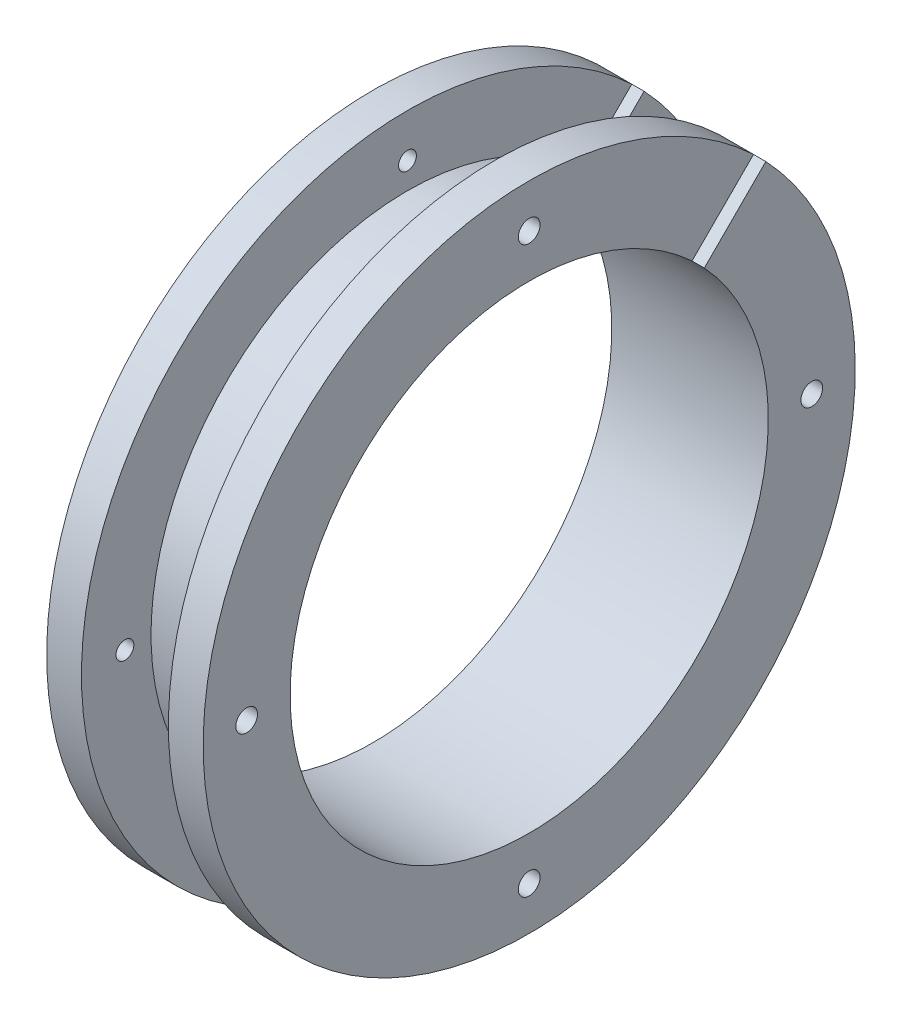
ISO-10303-21;
HEADER;
FILE_DESCRIPTION(('STEP AP214'),'2;1');
FILE_NAME('part.step','',(''),(''),'','','');
FILE_SCHEMA(('AUTOMOTIVE_DESIGN { 1 0 10303 214 1 1 1 1 }'));
ENDSEC;
DATA;
#1=APPLICATION_CONTEXT('core data for automotive mechanical design processes');
#2=APPLICATION_PROTOCOL_DEFINITION('international standard','automotive_design',2000,#1);
#3=PRODUCT_CONTEXT('',#1,'mechanical');
#4=PRODUCT('Part','Part','',(#3));
#5=PRODUCT_RELATED_PRODUCT_CATEGORY('part','',(#4));
#6=PRODUCT_DEFINITION_FORMATION('','',#4);
#7=PRODUCT_DEFINITION_CONTEXT('part definition',#1,'design');
#8=PRODUCT_DEFINITION('design','',#6,#7);
#9=PRODUCT_DEFINITION_SHAPE('','',#8);
#10=(LENGTH_UNIT() NAMED_UNIT(*) SI_UNIT(.MILLI.,.METRE.));
#11=(NAMED_UNIT(*) PLANE_ANGLE_UNIT() SI_UNIT($,.RADIAN.));
#12=(NAMED_UNIT(*) SI_UNIT($,.STERADIAN.) SOLID_ANGLE_UNIT());
#13=UNCERTAINTY_MEASURE_WITH_UNIT(LENGTH_MEASURE(1.E-05),#10,'distance_accuracy_value','');
#14=(GEOMETRIC_REPRESENTATION_CONTEXT(3) GLOBAL_UNCERTAINTY_ASSIGNED_CONTEXT((#13)) GLOBAL_UNIT_ASSIGNED_CONTEXT((#10,
#11,#12)) REPRESENTATION_CONTEXT('',''));
#15=CARTESIAN_POINT('',(0.,0.,0.));
#16=DIRECTION('',(0.,0.,1.));
#17=DIRECTION('',(1.,0.,0.));
#18=AXIS2_PLACEMENT_3D('',#15,#16,#17);
#19=CARTESIAN_POINT('',(-18.,37.5,0.));
#20=DIRECTION('',(-1.,0.,0.));
#21=DIRECTION('',(0.,0.,1.));
#22=AXIS2_PLACEMENT_3D('',#19,#20,#21);
#23=PLANE('',#22);
#24=DIRECTION('',(0.,-0.707106781186547,0.707106781186548));
#25=VECTOR('',#24,1.);
#26=CARTESIAN_POINT('',(-18.,18.7254689616222,-20.1396825239953));
#27=LINE('',#26,#25);
#28=CARTESIAN_POINT('',(-18.,25.799967746192,-27.2141813085651));
#29=VERTEX_POINT('',#28);
#30=CARTESIAN_POINT('',(-18.,18.7254689616222,-20.1396825239953));
#31=VERTEX_POINT('',#30);
#32=EDGE_CURVE('E98',#29,#31,#27,.T.);
#33=ORIENTED_EDGE('',*,*,#32,.F.);
#34=CARTESIAN_POINT('',(-18.,0.,0.));
#35=DIRECTION('',(1.,0.,0.));
#36=DIRECTION('',(0.,0.,-1.));
#37=AXIS2_PLACEMENT_3D('',#34,#35,#36);
#38=CIRCLE('',#37,37.5);
#39=CARTESIAN_POINT('',(-18.,27.2141813085651,-25.799967746192));
#40=VERTEX_POINT('',#39);
#41=EDGE_CURVE('E148',#40,#29,#38,.T.);
#42=ORIENTED_EDGE('',*,*,#41,.F.);
#43=DIRECTION('',(0.,0.707106781186547,-0.707106781186548));
#44=VECTOR('',#43,1.);
#45=CARTESIAN_POINT('',(-18.,27.2236110756821,-25.809397513309));
#46=LINE('',#45,#44);
#47=CARTESIAN_POINT('',(-18.,20.1396825239953,-18.7254689616222));
#48=VERTEX_POINT('',#47);
#49=EDGE_CURVE('E52',#48,#40,#46,.T.);
#50=ORIENTED_EDGE('',*,*,#49,.F.);
#51=CARTESIAN_POINT('',(-18.,0.,0.));
#52=DIRECTION('',(1.,0.,0.));
#53=DIRECTION('',(0.,0.,-1.));
#54=AXIS2_PLACEMENT_3D('',#51,#52,#53);
#55=CIRCLE('',#54,27.5);
#56=EDGE_CURVE('E118',#48,#31,#55,.T.);
#57=ORIENTED_EDGE('',*,*,#56,.T.);
#58=EDGE_LOOP('',(#33,#42,#50,#57));
#59=FACE_BOUND('',#58,.T.);
#60=CARTESIAN_POINT('',(-18.,-32.5,0.));
#61=DIRECTION('',(-1.,0.,0.));
#62=DIRECTION('',(0.,0.,1.));
#63=AXIS2_PLACEMENT_3D('',#60,#61,#62);
#64=CIRCLE('',#63,1.02499999999999);
#65=CARTESIAN_POINT('',(-18.,-32.5,1.02499999999998));
#66=VERTEX_POINT('',#65);
#67=EDGE_CURVE('E198',#66,#66,#64,.T.);
#68=ORIENTED_EDGE('',*,*,#67,.F.);
#69=EDGE_LOOP('',(#68));
#70=FACE_BOUND('',#69,.T.);
#71=CARTESIAN_POINT('',(-18.,0.,-32.5));
#72=DIRECTION('',(-1.,0.,0.));
#73=DIRECTION('',(0.,0.,1.));
#74=AXIS2_PLACEMENT_3D('',#71,#72,#73);
#75=CIRCLE('',#74,1.02499999999999);
#76=CARTESIAN_POINT('',(-18.,0.,-31.475));
#77=VERTEX_POINT('',#76);
#78=EDGE_CURVE('E204',#77,#77,#75,.T.);
#79=ORIENTED_EDGE('',*,*,#78,.F.);
#80=EDGE_LOOP('',(#79));
#81=FACE_BOUND('',#80,.T.);
#82=CARTESIAN_POINT('',(-18.,0.,32.5));
#83=DIRECTION('',(-1.,0.,0.));
#84=DIRECTION('',(0.,0.,1.));
#85=AXIS2_PLACEMENT_3D('',#82,#83,#84);
#86=CIRCLE('',#85,1.02499999999999);
#87=CARTESIAN_POINT('',(-18.,0.,33.525));
#88=VERTEX_POINT('',#87);
#89=EDGE_CURVE('E210',#88,#88,#86,.T.);
#90=ORIENTED_EDGE('',*,*,#89,.F.);
#91=EDGE_LOOP('',(#90));
#92=FACE_BOUND('',#91,.T.);
#93=CARTESIAN_POINT('',(-18.,32.5,0.));
#94=DIRECTION('',(-1.,0.,0.));
#95=DIRECTION('',(0.,0.,1.));
#96=AXIS2_PLACEMENT_3D('',#93,#94,#95);
#97=CIRCLE('',#96,1.02499999999999);
#98=CARTESIAN_POINT('',(-18.,32.5,1.02499999999996));
#99=VERTEX_POINT('',#98);
#100=EDGE_CURVE('E216',#99,#99,#97,.T.);
#101=ORIENTED_EDGE('',*,*,#100,.F.);
#102=EDGE_LOOP('',(#101));
#103=FACE_BOUND('',#102,.T.);
#104=ADVANCED_FACE('F31',(#59,#70,#81,#92,#103),#23,.T.);
#105=CARTESIAN_POINT('',(0.,0.,0.));
#106=DIRECTION('',(1.,0.,0.));
#107=DIRECTION('',(0.,0.,-1.));
#108=AXIS2_PLACEMENT_3D('',#105,#106,#107);
#109=CYLINDRICAL_SURFACE('',#108,27.5);
#110=DIRECTION('',(-1.,0.,0.));
#111=VECTOR('',#110,1.);
#112=CARTESIAN_POINT('',(0.,18.7254689616222,-20.1396825239953));
#113=LINE('',#112,#111);
#114=CARTESIAN_POINT('',(0.,18.7254689616222,-20.1396825239953));
#115=VERTEX_POINT('',#114);
#116=EDGE_CURVE('E92',#115,#31,#113,.T.);
#117=ORIENTED_EDGE('',*,*,#116,.T.);
#118=ORIENTED_EDGE('',*,*,#56,.F.);
#119=DIRECTION('',(-1.,0.,0.));
#120=VECTOR('',#119,1.);
#121=CARTESIAN_POINT('',(0.,20.1396825239953,-18.7254689616222));
#122=LINE('',#121,#120);
#123=CARTESIAN_POINT('',(0.,20.1396825239953,-18.7254689616222));
#124=VERTEX_POINT('',#123);
#125=EDGE_CURVE('E103',#124,#48,#122,.T.);
#126=ORIENTED_EDGE('',*,*,#125,.F.);
#127=CARTESIAN_POINT('',(0.,0.,0.));
#128=DIRECTION('',(1.,0.,0.));
#129=DIRECTION('',(0.,0.,-1.));
#130=AXIS2_PLACEMENT_3D('',#127,#128,#129);
#131=CIRCLE('',#130,27.5);
#132=EDGE_CURVE('E112',#124,#115,#131,.T.);
#133=ORIENTED_EDGE('',*,*,#132,.T.);
#134=EDGE_LOOP('',(#117,#118,#126,#133));
#135=FACE_BOUND('',#134,.T.);
#136=ADVANCED_FACE('F117',(#135),#109,.F.);
#137=CARTESIAN_POINT('',(0.,27.5,0.));
#138=DIRECTION('',(1.,0.,0.));
#139=DIRECTION('',(0.,0.,-1.));
#140=AXIS2_PLACEMENT_3D('',#137,#138,#139);
#141=PLANE('',#140);
#142=DIRECTION('',(0.,-0.707106781186547,0.707106781186548));
#143=VECTOR('',#142,1.);
#144=CARTESIAN_POINT('',(0.,18.7254689616222,-20.1396825239953));
#145=LINE('',#144,#143);
#146=CARTESIAN_POINT('',(0.,25.799967746192,-27.2141813085651));
#147=VERTEX_POINT('',#146);
#148=EDGE_CURVE('E95',#147,#115,#145,.T.);
#149=ORIENTED_EDGE('',*,*,#148,.T.);
#150=ORIENTED_EDGE('',*,*,#132,.F.);
#151=DIRECTION('',(0.,0.707106781186547,-0.707106781186548));
#152=VECTOR('',#151,1.);
#153=CARTESIAN_POINT('',(0.,27.2236110756821,-25.809397513309));
#154=LINE('',#153,#152);
#155=CARTESIAN_POINT('',(0.,27.2141813085651,-25.799967746192));
#156=VERTEX_POINT('',#155);
#157=EDGE_CURVE('E104',#124,#156,#154,.T.);
#158=ORIENTED_EDGE('',*,*,#157,.T.);
#159=CARTESIAN_POINT('',(0.,0.,0.));
#160=DIRECTION('',(1.,0.,0.));
#161=DIRECTION('',(0.,0.,-1.));
#162=AXIS2_PLACEMENT_3D('',#159,#160,#161);
#163=CIRCLE('',#162,37.5);
#164=EDGE_CURVE('E114',#156,#147,#163,.T.);
#165=ORIENTED_EDGE('',*,*,#164,.T.);
#166=EDGE_LOOP('',(#149,#150,#158,#165));
#167=FACE_BOUND('',#166,.T.);
#168=CARTESIAN_POINT('',(0.,0.,32.5));
#169=DIRECTION('',(1.,0.,0.));
#170=DIRECTION('',(0.,0.,-1.));
#171=AXIS2_PLACEMENT_3D('',#168,#169,#170);
#172=CIRCLE('',#171,1.24999999999999);
#173=CARTESIAN_POINT('',(0.,0.,31.25));
#174=VERTEX_POINT('',#173);
#175=EDGE_CURVE('E128',#174,#174,#172,.T.);
#176=ORIENTED_EDGE('',*,*,#175,.F.);
#177=EDGE_LOOP('',(#176));
#178=FACE_BOUND('',#177,.T.);
#179=CARTESIAN_POINT('',(0.,-32.5,0.));
#180=DIRECTION('',(1.,0.,0.));
#181=DIRECTION('',(0.,0.,-1.));
#182=AXIS2_PLACEMENT_3D('',#179,#180,#181);
#183=CIRCLE('',#182,1.24999999999999);
#184=CARTESIAN_POINT('',(0.,-32.5,-1.25));
#185=VERTEX_POINT('',#184);
#186=EDGE_CURVE('E127',#185,#185,#183,.T.);
#187=ORIENTED_EDGE('',*,*,#186,.F.);
#188=EDGE_LOOP('',(#187));
#189=FACE_BOUND('',#188,.T.);
#190=CARTESIAN_POINT('',(0.,0.,-32.5));
#191=DIRECTION('',(1.,0.,0.));
#192=DIRECTION('',(0.,0.,-1.));
#193=AXIS2_PLACEMENT_3D('',#190,#191,#192);
#194=CIRCLE('',#193,1.24999999999999);
#195=CARTESIAN_POINT('',(0.,0.,-33.75));
#196=VERTEX_POINT('',#195);
#197=EDGE_CURVE('E186',#196,#196,#194,.T.);
#198=ORIENTED_EDGE('',*,*,#197,.F.);
#199=EDGE_LOOP('',(#198));
#200=FACE_BOUND('',#199,.T.);
#201=CARTESIAN_POINT('',(0.,32.5,0.));
#202=DIRECTION('',(1.,0.,0.));
#203=DIRECTION('',(0.,0.,-1.));
#204=AXIS2_PLACEMENT_3D('',#201,#202,#203);
#205=CIRCLE('',#204,1.24999999999999);
#206=CARTESIAN_POINT('',(0.,32.5,-1.25000000000002));
#207=VERTEX_POINT('',#206);
#208=EDGE_CURVE('E192',#207,#207,#205,.T.);
#209=ORIENTED_EDGE('',*,*,#208,.F.);
#210=EDGE_LOOP('',(#209));
#211=FACE_BOUND('',#210,.T.);
#212=ADVANCED_FACE('F109',(#167,#178,#189,#200,#211),#141,.T.);
#213=CARTESIAN_POINT('',(0.,0.,0.));
#214=DIRECTION('',(1.,0.,0.));
#215=DIRECTION('',(0.,0.,-1.));
#216=AXIS2_PLACEMENT_3D('',#213,#214,#215);
#217=CYLINDRICAL_SURFACE('',#216,37.5);
#218=DIRECTION('',(1.,0.,0.));
#219=VECTOR('',#218,1.);
#220=CARTESIAN_POINT('',(0.,25.799967746192,-27.2141813085651));
#221=LINE('',#220,#219);
#222=CARTESIAN_POINT('',(-4.,25.799967746192,-27.2141813085651));
#223=VERTEX_POINT('',#222);
#224=EDGE_CURVE('E162',#147,#223,#221,.F.);
#225=ORIENTED_EDGE('',*,*,#224,.F.);
#226=ORIENTED_EDGE('',*,*,#164,.F.);
#227=DIRECTION('',(1.,0.,0.));
#228=VECTOR('',#227,1.);
#229=CARTESIAN_POINT('',(0.,27.2141813085651,-25.799967746192));
#230=LINE('',#229,#228);
#231=CARTESIAN_POINT('',(-4.,27.2141813085651,-25.799967746192));
#232=VERTEX_POINT('',#231);
#233=EDGE_CURVE('E163',#232,#156,#230,.T.);
#234=ORIENTED_EDGE('',*,*,#233,.F.);
#235=CARTESIAN_POINT('',(-4.,0.,0.));
#236=DIRECTION('',(1.,0.,0.));
#237=DIRECTION('',(0.,0.,-1.));
#238=AXIS2_PLACEMENT_3D('',#235,#236,#237);
#239=CIRCLE('',#238,37.5);
#240=EDGE_CURVE('E121',#232,#223,#239,.T.);
#241=ORIENTED_EDGE('',*,*,#240,.T.);
#242=EDGE_LOOP('',(#225,#226,#234,#241));
#243=FACE_BOUND('',#242,.T.);
#244=ADVANCED_FACE('F161',(#243),#217,.T.);
#245=CARTESIAN_POINT('',(-4.,37.5,0.));
#246=DIRECTION('',(-1.,0.,0.));
#247=DIRECTION('',(0.,0.,1.));
#248=AXIS2_PLACEMENT_3D('',#245,#246,#247);
#249=PLANE('',#248);
#250=DIRECTION('',(0.,-0.707106781186547,0.707106781186548));
#251=VECTOR('',#250,1.);
#252=CARTESIAN_POINT('',(-4.,18.0428932188134,-19.4571067811865));
#253=LINE('',#252,#251);
#254=CARTESIAN_POINT('',(-4.,20.1405549582028,-21.5547685205759));
#255=VERTEX_POINT('',#254);
#256=EDGE_CURVE('E171',#223,#255,#253,.T.);
#257=ORIENTED_EDGE('',*,*,#256,.F.);
#258=ORIENTED_EDGE('',*,*,#240,.F.);
#259=DIRECTION('',(0.,0.707106781186547,-0.707106781186548));
#260=VECTOR('',#259,1.);
#261=CARTESIAN_POINT('',(-4.,19.4571067811865,-18.0428932188134));
#262=LINE('',#261,#260);
#263=CARTESIAN_POINT('',(-4.,21.5547685205759,-20.1405549582028));
#264=VERTEX_POINT('',#263);
#265=EDGE_CURVE('E169',#264,#232,#262,.T.);
#266=ORIENTED_EDGE('',*,*,#265,.F.);
#267=CARTESIAN_POINT('',(-4.,0.,0.));
#268=DIRECTION('',(1.,0.,0.));
#269=DIRECTION('',(0.,0.,-1.));
#270=AXIS2_PLACEMENT_3D('',#267,#268,#269);
#271=CIRCLE('',#270,29.5);
#272=EDGE_CURVE('E150',#264,#255,#271,.T.);
#273=ORIENTED_EDGE('',*,*,#272,.T.);
#274=EDGE_LOOP('',(#257,#258,#266,#273));
#275=FACE_BOUND('',#274,.T.);
#276=CARTESIAN_POINT('',(-4.,0.,32.5));
#277=DIRECTION('',(-1.,0.,0.));
#278=DIRECTION('',(0.,0.,1.));
#279=AXIS2_PLACEMENT_3D('',#276,#277,#278);
#280=CIRCLE('',#279,1.24999999999999);
#281=CARTESIAN_POINT('',(-4.,0.,33.75));
#282=VERTEX_POINT('',#281);
#283=EDGE_CURVE('E125',#282,#282,#280,.T.);
#284=ORIENTED_EDGE('',*,*,#283,.F.);
#285=EDGE_LOOP('',(#284));
#286=FACE_BOUND('',#285,.T.);
#287=CARTESIAN_POINT('',(-4.,-32.5,0.));
#288=DIRECTION('',(-1.,0.,0.));
#289=DIRECTION('',(0.,0.,1.));
#290=AXIS2_PLACEMENT_3D('',#287,#288,#289);
#291=CIRCLE('',#290,1.24999999999999);
#292=CARTESIAN_POINT('',(-4.,-32.5,1.24999999999997));
#293=VERTEX_POINT('',#292);
#294=EDGE_CURVE('E183',#293,#293,#291,.T.);
#295=ORIENTED_EDGE('',*,*,#294,.F.);
#296=EDGE_LOOP('',(#295));
#297=FACE_BOUND('',#296,.T.);
#298=CARTESIAN_POINT('',(-4.,0.,-32.5));
#299=DIRECTION('',(-1.,0.,0.));
#300=DIRECTION('',(0.,0.,1.));
#301=AXIS2_PLACEMENT_3D('',#298,#299,#300);
#302=CIRCLE('',#301,1.24999999999999);
#303=CARTESIAN_POINT('',(-4.,0.,-31.25));
#304=VERTEX_POINT('',#303);
#305=EDGE_CURVE('E189',#304,#304,#302,.T.);
#306=ORIENTED_EDGE('',*,*,#305,.F.);
#307=EDGE_LOOP('',(#306));
#308=FACE_BOUND('',#307,.T.);
#309=CARTESIAN_POINT('',(-4.,32.5,0.));
#310=DIRECTION('',(-1.,0.,0.));
#311=DIRECTION('',(0.,0.,1.));
#312=AXIS2_PLACEMENT_3D('',#309,#310,#311);
#313=CIRCLE('',#312,1.24999999999999);
#314=CARTESIAN_POINT('',(-4.,32.5,1.24999999999996));
#315=VERTEX_POINT('',#314);
#316=EDGE_CURVE('E195',#315,#315,#313,.T.);
#317=ORIENTED_EDGE('',*,*,#316,.F.);
#318=EDGE_LOOP('',(#317));
#319=FACE_BOUND('',#318,.T.);
#320=ADVANCED_FACE('F167',(#275,#286,#297,#308,#319),#249,.T.);
#321=CARTESIAN_POINT('',(0.,0.,0.));
#322=DIRECTION('',(1.,0.,0.));
#323=DIRECTION('',(0.,0.,-1.));
#324=AXIS2_PLACEMENT_3D('',#321,#322,#323);
#325=CYLINDRICAL_SURFACE('',#324,29.5);
#326=DIRECTION('',(1.,0.,0.));
#327=VECTOR('',#326,1.);
#328=CARTESIAN_POINT('',(0.,20.1405549582028,-21.5547685205759));
#329=LINE('',#328,#327);
#330=CARTESIAN_POINT('',(-14.,20.1405549582028,-21.5547685205759));
#331=VERTEX_POINT('',#330);
#332=EDGE_CURVE('E173',#255,#331,#329,.F.);
#333=ORIENTED_EDGE('',*,*,#332,.F.);
#334=ORIENTED_EDGE('',*,*,#272,.F.);
#335=DIRECTION('',(1.,0.,0.));
#336=VECTOR('',#335,1.);
#337=CARTESIAN_POINT('',(0.,21.5547685205759,-20.1405549582028));
#338=LINE('',#337,#336);
#339=CARTESIAN_POINT('',(-14.,21.5547685205759,-20.1405549582029));
#340=VERTEX_POINT('',#339);
#341=EDGE_CURVE('E145',#340,#264,#338,.T.);
#342=ORIENTED_EDGE('',*,*,#341,.F.);
#343=CARTESIAN_POINT('',(-14.,0.,0.));
#344=DIRECTION('',(1.,0.,0.));
#345=DIRECTION('',(0.,0.,-1.));
#346=AXIS2_PLACEMENT_3D('',#343,#344,#345);
#347=CIRCLE('',#346,29.5);
#348=EDGE_CURVE('E144',#340,#331,#347,.T.);
#349=ORIENTED_EDGE('',*,*,#348,.T.);
#350=EDGE_LOOP('',(#333,#334,#342,#349));
#351=FACE_BOUND('',#350,.T.);
#352=ADVANCED_FACE('F225',(#351),#325,.T.);
#353=CARTESIAN_POINT('',(-14.,29.5,0.));
#354=DIRECTION('',(1.,0.,0.));
#355=DIRECTION('',(0.,0.,-1.));
#356=AXIS2_PLACEMENT_3D('',#353,#354,#355);
#357=PLANE('',#356);
#358=DIRECTION('',(0.,0.707106781186547,-0.707106781186548));
#359=VECTOR('',#358,1.);
#360=CARTESIAN_POINT('',(-14.,14.0428932188134,-15.4571067811865));
#361=LINE('',#360,#359);
#362=CARTESIAN_POINT('',(-14.,25.799967746192,-27.2141813085651));
#363=VERTEX_POINT('',#362);
#364=EDGE_CURVE('E44',#331,#363,#361,.T.);
#365=ORIENTED_EDGE('',*,*,#364,.F.);
#366=ORIENTED_EDGE('',*,*,#348,.F.);
#367=DIRECTION('',(0.,-0.707106781186547,0.707106781186548));
#368=VECTOR('',#367,1.);
#369=CARTESIAN_POINT('',(-14.,15.4571067811865,-14.0428932188135));
#370=LINE('',#369,#368);
#371=CARTESIAN_POINT('',(-14.,27.2141813085651,-25.799967746192));
#372=VERTEX_POINT('',#371);
#373=EDGE_CURVE('E131',#372,#340,#370,.T.);
#374=ORIENTED_EDGE('',*,*,#373,.F.);
#375=CARTESIAN_POINT('',(-14.,0.,0.));
#376=DIRECTION('',(1.,0.,0.));
#377=DIRECTION('',(0.,0.,-1.));
#378=AXIS2_PLACEMENT_3D('',#375,#376,#377);
#379=CIRCLE('',#378,37.5);
#380=EDGE_CURVE('E142',#372,#363,#379,.T.);
#381=ORIENTED_EDGE('',*,*,#380,.T.);
#382=EDGE_LOOP('',(#365,#366,#374,#381));
#383=FACE_BOUND('',#382,.T.);
#384=CARTESIAN_POINT('',(-14.,-32.5,0.));
#385=DIRECTION('',(1.,0.,0.));
#386=DIRECTION('',(0.,0.,-1.));
#387=AXIS2_PLACEMENT_3D('',#384,#385,#386);
#388=CIRCLE('',#387,1.02499999999999);
#389=CARTESIAN_POINT('',(-14.,-32.5,-1.02500000000001));
#390=VERTEX_POINT('',#389);
#391=EDGE_CURVE('E201',#390,#390,#388,.T.);
#392=ORIENTED_EDGE('',*,*,#391,.F.);
#393=EDGE_LOOP('',(#392));
#394=FACE_BOUND('',#393,.T.);
#395=CARTESIAN_POINT('',(-14.,0.,-32.5));
#396=DIRECTION('',(1.,0.,0.));
#397=DIRECTION('',(0.,0.,-1.));
#398=AXIS2_PLACEMENT_3D('',#395,#396,#397);
#399=CIRCLE('',#398,1.02499999999999);
#400=CARTESIAN_POINT('',(-14.,0.,-33.525));
#401=VERTEX_POINT('',#400);
#402=EDGE_CURVE('E207',#401,#401,#399,.T.);
#403=ORIENTED_EDGE('',*,*,#402,.F.);
#404=EDGE_LOOP('',(#403));
#405=FACE_BOUND('',#404,.T.);
#406=CARTESIAN_POINT('',(-14.,0.,32.5));
#407=DIRECTION('',(1.,0.,0.));
#408=DIRECTION('',(0.,0.,-1.));
#409=AXIS2_PLACEMENT_3D('',#406,#407,#408);
#410=CIRCLE('',#409,1.02499999999999);
#411=CARTESIAN_POINT('',(-14.,0.,31.475));
#412=VERTEX_POINT('',#411);
#413=EDGE_CURVE('E213',#412,#412,#410,.T.);
#414=ORIENTED_EDGE('',*,*,#413,.F.);
#415=EDGE_LOOP('',(#414));
#416=FACE_BOUND('',#415,.T.);
#417=CARTESIAN_POINT('',(-14.,32.5,0.));
#418=DIRECTION('',(1.,0.,0.));
#419=DIRECTION('',(0.,0.,-1.));
#420=AXIS2_PLACEMENT_3D('',#417,#418,#419);
#421=CIRCLE('',#420,1.02499999999999);
#422=CARTESIAN_POINT('',(-14.,32.5,-1.02500000000002));
#423=VERTEX_POINT('',#422);
#424=EDGE_CURVE('E152',#423,#423,#421,.T.);
#425=ORIENTED_EDGE('',*,*,#424,.F.);
#426=EDGE_LOOP('',(#425));
#427=FACE_BOUND('',#426,.T.);
#428=ADVANCED_FACE('F140',(#383,#394,#405,#416,#427),#357,.T.);
#429=CARTESIAN_POINT('',(0.,0.,0.));
#430=DIRECTION('',(1.,0.,0.));
#431=DIRECTION('',(0.,0.,-1.));
#432=AXIS2_PLACEMENT_3D('',#429,#430,#431);
#433=CYLINDRICAL_SURFACE('',#432,37.5);
#434=DIRECTION('',(1.,0.,0.));
#435=VECTOR('',#434,1.);
#436=CARTESIAN_POINT('',(0.,25.799967746192,-27.2141813085651));
#437=LINE('',#436,#435);
#438=EDGE_CURVE('E11',#363,#29,#437,.F.);
#439=ORIENTED_EDGE('',*,*,#438,.F.);
#440=ORIENTED_EDGE('',*,*,#380,.F.);
#441=DIRECTION('',(1.,0.,0.));
#442=VECTOR('',#441,1.);
#443=CARTESIAN_POINT('',(0.,27.2141813085651,-25.799967746192));
#444=LINE('',#443,#442);
#445=EDGE_CURVE('E38',#40,#372,#444,.T.);
#446=ORIENTED_EDGE('',*,*,#445,.F.);
#447=ORIENTED_EDGE('',*,*,#41,.T.);
#448=EDGE_LOOP('',(#439,#440,#446,#447));
#449=FACE_BOUND('',#448,.T.);
#450=ADVANCED_FACE('F147',(#449),#433,.T.);
#451=CARTESIAN_POINT('',(-18.,32.5,0.));
#452=DIRECTION('',(-1.,0.,0.));
#453=DIRECTION('',(0.,0.,1.));
#454=AXIS2_PLACEMENT_3D('',#451,#452,#453);
#455=CYLINDRICAL_SURFACE('',#454,1.02499999999999);
#456=ORIENTED_EDGE('',*,*,#424,.T.);
#457=EDGE_LOOP('',(#456));
#458=FACE_BOUND('',#457,.T.);
#459=ORIENTED_EDGE('',*,*,#100,.T.);
#460=EDGE_LOOP('',(#459));
#461=FACE_BOUND('',#460,.T.);
#462=ADVANCED_FACE('F221',(#458,#461),#455,.F.);
#463=CARTESIAN_POINT('',(-18.,0.,32.5));
#464=DIRECTION('',(-1.,0.,0.));
#465=DIRECTION('',(0.,0.,1.));
#466=AXIS2_PLACEMENT_3D('',#463,#464,#465);
#467=CYLINDRICAL_SURFACE('',#466,1.02499999999999);
#468=ORIENTED_EDGE('',*,*,#413,.T.);
#469=EDGE_LOOP('',(#468));
#470=FACE_BOUND('',#469,.T.);
#471=ORIENTED_EDGE('',*,*,#89,.T.);
#472=EDGE_LOOP('',(#471));
#473=FACE_BOUND('',#472,.T.);
#474=ADVANCED_FACE('F248',(#470,#473),#467,.F.);
#475=CARTESIAN_POINT('',(-18.,0.,-32.5));
#476=DIRECTION('',(-1.,0.,0.));
#477=DIRECTION('',(0.,0.,1.));
#478=AXIS2_PLACEMENT_3D('',#475,#476,#477);
#479=CYLINDRICAL_SURFACE('',#478,1.02499999999999);
#480=ORIENTED_EDGE('',*,*,#402,.T.);
#481=EDGE_LOOP('',(#480));
#482=FACE_BOUND('',#481,.T.);
#483=ORIENTED_EDGE('',*,*,#78,.T.);
#484=EDGE_LOOP('',(#483));
#485=FACE_BOUND('',#484,.T.);
#486=ADVANCED_FACE('F253',(#482,#485),#479,.F.);
#487=CARTESIAN_POINT('',(-18.,-32.5,0.));
#488=DIRECTION('',(-1.,0.,0.));
#489=DIRECTION('',(0.,0.,1.));
#490=AXIS2_PLACEMENT_3D('',#487,#488,#489);
#491=CYLINDRICAL_SURFACE('',#490,1.02499999999999);
#492=ORIENTED_EDGE('',*,*,#391,.T.);
#493=EDGE_LOOP('',(#492));
#494=FACE_BOUND('',#493,.T.);
#495=ORIENTED_EDGE('',*,*,#67,.T.);
#496=EDGE_LOOP('',(#495));
#497=FACE_BOUND('',#496,.T.);
#498=ADVANCED_FACE('F259',(#494,#497),#491,.F.);
#499=CARTESIAN_POINT('',(0.,32.5,0.));
#500=DIRECTION('',(1.,0.,0.));
#501=DIRECTION('',(0.,0.,-1.));
#502=AXIS2_PLACEMENT_3D('',#499,#500,#501);
#503=CYLINDRICAL_SURFACE('',#502,1.24999999999999);
#504=ORIENTED_EDGE('',*,*,#316,.T.);
#505=EDGE_LOOP('',(#504));
#506=FACE_BOUND('',#505,.T.);
#507=ORIENTED_EDGE('',*,*,#208,.T.);
#508=EDGE_LOOP('',(#507));
#509=FACE_BOUND('',#508,.T.);
#510=ADVANCED_FACE('F263',(#506,#509),#503,.F.);
#511=CARTESIAN_POINT('',(0.,0.,-32.5));
#512=DIRECTION('',(1.,0.,0.));
#513=DIRECTION('',(0.,0.,-1.));
#514=AXIS2_PLACEMENT_3D('',#511,#512,#513);
#515=CYLINDRICAL_SURFACE('',#514,1.24999999999999);
#516=ORIENTED_EDGE('',*,*,#305,.T.);
#517=EDGE_LOOP('',(#516));
#518=FACE_BOUND('',#517,.T.);
#519=ORIENTED_EDGE('',*,*,#197,.T.);
#520=EDGE_LOOP('',(#519));
#521=FACE_BOUND('',#520,.T.);
#522=ADVANCED_FACE('F267',(#518,#521),#515,.F.);
#523=CARTESIAN_POINT('',(0.,-32.5,0.));
#524=DIRECTION('',(1.,0.,0.));
#525=DIRECTION('',(0.,0.,-1.));
#526=AXIS2_PLACEMENT_3D('',#523,#524,#525);
#527=CYLINDRICAL_SURFACE('',#526,1.24999999999999);
#528=ORIENTED_EDGE('',*,*,#294,.T.);
#529=EDGE_LOOP('',(#528));
#530=FACE_BOUND('',#529,.T.);
#531=ORIENTED_EDGE('',*,*,#186,.T.);
#532=EDGE_LOOP('',(#531));
#533=FACE_BOUND('',#532,.T.);
#534=ADVANCED_FACE('F271',(#530,#533),#527,.F.);
#535=CARTESIAN_POINT('',(0.,0.,32.5));
#536=DIRECTION('',(1.,0.,0.));
#537=DIRECTION('',(0.,0.,-1.));
#538=AXIS2_PLACEMENT_3D('',#535,#536,#537);
#539=CYLINDRICAL_SURFACE('',#538,1.24999999999999);
#540=ORIENTED_EDGE('',*,*,#283,.T.);
#541=EDGE_LOOP('',(#540));
#542=FACE_BOUND('',#541,.T.);
#543=ORIENTED_EDGE('',*,*,#175,.T.);
#544=EDGE_LOOP('',(#543));
#545=FACE_BOUND('',#544,.T.);
#546=ADVANCED_FACE('F275',(#542,#545),#539,.F.);
#547=CARTESIAN_POINT('',(0.,27.2236110756821,-25.809397513309));
#548=DIRECTION('',(0.,0.707106781186548,0.707106781186547));
#549=DIRECTION('',(0.,-0.707106781186547,0.707106781186548));
#550=AXIS2_PLACEMENT_3D('',#547,#548,#549);
#551=PLANE('',#550);
#552=ORIENTED_EDGE('',*,*,#233,.T.);
#553=ORIENTED_EDGE('',*,*,#157,.F.);
#554=ORIENTED_EDGE('',*,*,#125,.T.);
#555=ORIENTED_EDGE('',*,*,#49,.T.);
#556=ORIENTED_EDGE('',*,*,#445,.T.);
#557=ORIENTED_EDGE('',*,*,#373,.T.);
#558=ORIENTED_EDGE('',*,*,#341,.T.);
#559=ORIENTED_EDGE('',*,*,#265,.T.);
#560=EDGE_LOOP('',(#552,#553,#554,#555,#556,#557,#558,#559));
#561=FACE_BOUND('',#560,.T.);
#562=ADVANCED_FACE('F130',(#561),#551,.F.);
#563=CARTESIAN_POINT('',(0.,18.7254689616222,-20.1396825239953));
#564=DIRECTION('',(0.,-0.707106781186548,-0.707106781186547));
#565=DIRECTION('',(0.,0.707106781186547,-0.707106781186548));
#566=AXIS2_PLACEMENT_3D('',#563,#564,#565);
#567=PLANE('',#566);
#568=ORIENTED_EDGE('',*,*,#224,.T.);
#569=ORIENTED_EDGE('',*,*,#256,.T.);
#570=ORIENTED_EDGE('',*,*,#332,.T.);
#571=ORIENTED_EDGE('',*,*,#364,.T.);
#572=ORIENTED_EDGE('',*,*,#438,.T.);
#573=ORIENTED_EDGE('',*,*,#32,.T.);
#574=ORIENTED_EDGE('',*,*,#116,.F.);
#575=ORIENTED_EDGE('',*,*,#148,.F.);
#576=EDGE_LOOP('',(#568,#569,#570,#571,#572,#573,#574,#575));
#577=FACE_BOUND('',#576,.T.);
#578=ADVANCED_FACE('F94',(#577),#567,.F.);
#579=CLOSED_SHELL('',(#104,#136,#212,#244,#320,#352,#428,#450,#462,#474,#486,#498,#510,#522,
#534,#546,#562,#578));
#580=MANIFOLD_SOLID_BREP('B2',#579);
#581=ADVANCED_BREP_SHAPE_REPRESENTATION('',(#18,#580),#14);
#582=SHAPE_DEFINITION_REPRESENTATION(#9,#581);
ENDSEC;
END-ISO-10303-21;
